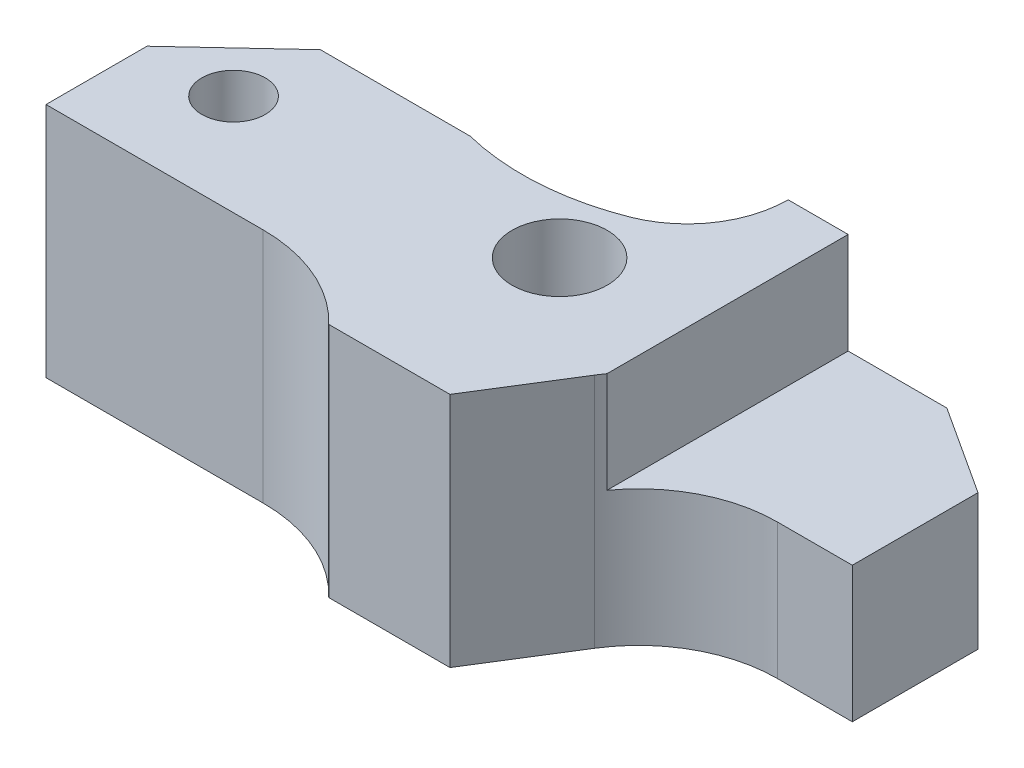
ISO-10303-21;
HEADER;
FILE_DESCRIPTION(('STEP AP214'),'2;1');
FILE_NAME('part.step','',(''),(''),'','','');
FILE_SCHEMA(('AUTOMOTIVE_DESIGN { 1 0 10303 214 1 1 1 1 }'));
ENDSEC;
DATA;
#1=APPLICATION_CONTEXT('core data for automotive mechanical design processes');
#2=APPLICATION_PROTOCOL_DEFINITION('international standard','automotive_design',2000,#1);
#3=PRODUCT_CONTEXT('',#1,'mechanical');
#4=PRODUCT('Part','Part','',(#3));
#5=PRODUCT_RELATED_PRODUCT_CATEGORY('part','',(#4));
#6=PRODUCT_DEFINITION_FORMATION('','',#4);
#7=PRODUCT_DEFINITION_CONTEXT('part definition',#1,'design');
#8=PRODUCT_DEFINITION('design','',#6,#7);
#9=PRODUCT_DEFINITION_SHAPE('','',#8);
#10=(LENGTH_UNIT() NAMED_UNIT(*) SI_UNIT(.MILLI.,.METRE.));
#11=(NAMED_UNIT(*) PLANE_ANGLE_UNIT() SI_UNIT($,.RADIAN.));
#12=(NAMED_UNIT(*) SI_UNIT($,.STERADIAN.) SOLID_ANGLE_UNIT());
#13=UNCERTAINTY_MEASURE_WITH_UNIT(LENGTH_MEASURE(1.E-05),#10,'distance_accuracy_value','');
#14=(GEOMETRIC_REPRESENTATION_CONTEXT(3) GLOBAL_UNCERTAINTY_ASSIGNED_CONTEXT((#13)) GLOBAL_UNIT_ASSIGNED_CONTEXT((#10,
#11,#12)) REPRESENTATION_CONTEXT('',''));
#15=CARTESIAN_POINT('',(0.,0.,0.));
#16=DIRECTION('',(0.,0.,1.));
#17=DIRECTION('',(1.,0.,0.));
#18=AXIS2_PLACEMENT_3D('',#15,#16,#17);
#19=CARTESIAN_POINT('',(0.,82.,-64.));
#20=DIRECTION('',(0.,0.,1.));
#21=DIRECTION('',(1.,0.,0.));
#22=AXIS2_PLACEMENT_3D('',#19,#20,#21);
#23=PLANE('',#22);
#24=DIRECTION('',(1.,0.,0.));
#25=VECTOR('',#24,1.);
#26=CARTESIAN_POINT('',(74.6896475118054,55.,-64.));
#27=LINE('',#26,#25);
#28=CARTESIAN_POINT('',(31.0986925907159,55.,-64.));
#29=VERTEX_POINT('',#28);
#30=CARTESIAN_POINT('',(74.6896475118054,55.,-64.));
#31=VERTEX_POINT('',#30);
#32=EDGE_CURVE('E189',#29,#31,#27,.T.);
#33=ORIENTED_EDGE('',*,*,#32,.F.);
#34=DIRECTION('',(0.,-1.,0.));
#35=VECTOR('',#34,1.);
#36=CARTESIAN_POINT('',(31.0986925907159,82.,-64.));
#37=LINE('',#36,#35);
#38=CARTESIAN_POINT('',(31.0986925907159,82.,-64.));
#39=VERTEX_POINT('',#38);
#40=EDGE_CURVE('E201',#39,#29,#37,.T.);
#41=ORIENTED_EDGE('',*,*,#40,.F.);
#42=DIRECTION('',(-1.,0.,0.));
#43=VECTOR('',#42,1.);
#44=CARTESIAN_POINT('',(0.,82.,-64.));
#45=LINE('',#44,#43);
#46=CARTESIAN_POINT('',(83.,82.,-64.));
#47=VERTEX_POINT('',#46);
#48=EDGE_CURVE('E255',#47,#39,#45,.T.);
#49=ORIENTED_EDGE('',*,*,#48,.F.);
#50=DIRECTION('',(0.,-1.,0.));
#51=VECTOR('',#50,1.);
#52=CARTESIAN_POINT('',(83.,82.,-64.));
#53=LINE('',#52,#51);
#54=CARTESIAN_POINT('',(83.,0.,-64.));
#55=VERTEX_POINT('',#54);
#56=EDGE_CURVE('E54',#47,#55,#53,.T.);
#57=ORIENTED_EDGE('',*,*,#56,.T.);
#58=DIRECTION('',(-1.,0.,0.));
#59=VECTOR('',#58,1.);
#60=CARTESIAN_POINT('',(0.,0.,-64.));
#61=LINE('',#60,#59);
#62=CARTESIAN_POINT('',(31.0986925907159,0.,-64.));
#63=VERTEX_POINT('',#62);
#64=EDGE_CURVE('E288',#55,#63,#61,.T.);
#65=ORIENTED_EDGE('',*,*,#64,.T.);
#66=CARTESIAN_POINT('',(31.0986925907159,15.,-64.));
#67=VERTEX_POINT('',#66);
#68=EDGE_CURVE('E210',#67,#63,#37,.T.);
#69=ORIENTED_EDGE('',*,*,#68,.F.);
#70=DIRECTION('',(1.,0.,0.));
#71=VECTOR('',#70,1.);
#72=CARTESIAN_POINT('',(74.6896475118054,15.,-64.));
#73=LINE('',#72,#71);
#74=CARTESIAN_POINT('',(74.6896475118054,15.,-64.));
#75=VERTEX_POINT('',#74);
#76=EDGE_CURVE('E589',#67,#75,#73,.T.);
#77=ORIENTED_EDGE('',*,*,#76,.T.);
#78=DIRECTION('',(0.,-1.,0.));
#79=VECTOR('',#78,1.);
#80=CARTESIAN_POINT('',(74.6896475118054,55.,-64.));
#81=LINE('',#80,#79);
#82=EDGE_CURVE('E204',#31,#75,#81,.T.);
#83=ORIENTED_EDGE('',*,*,#82,.F.);
#84=EDGE_LOOP('',(#33,#41,#49,#57,#65,#69,#77,#83));
#85=FACE_BOUND('',#84,.T.);
#86=ADVANCED_FACE('F45',(#85),#23,.F.);
#87=CARTESIAN_POINT('',(-17.4573708795469,82.,-18.7207382905222));
#88=DIRECTION('',(-0.681998360062497,0.,-0.731353701619172));
#89=DIRECTION('',(-0.731353701619172,0.,0.681998360062497));
#90=AXIS2_PLACEMENT_3D('',#87,#88,#89);
#91=PLANE('',#90);
#92=ORIENTED_EDGE('',*,*,#40,.T.);
#93=DIRECTION('',(0.731353701619171,0.,-0.681998360062498));
#94=VECTOR('',#93,1.);
#95=CARTESIAN_POINT('',(0.,55.,-35.));
#96=LINE('',#95,#94);
#97=CARTESIAN_POINT('',(0.,55.,-35.));
#98=VERTEX_POINT('',#97);
#99=EDGE_CURVE('E184',#98,#29,#96,.T.);
#100=ORIENTED_EDGE('',*,*,#99,.F.);
#101=DIRECTION('',(0.,-1.,0.));
#102=VECTOR('',#101,1.);
#103=CARTESIAN_POINT('',(0.,82.,-35.));
#104=LINE('',#103,#102);
#105=CARTESIAN_POINT('',(0.,82.,-35.));
#106=VERTEX_POINT('',#105);
#107=EDGE_CURVE('E213',#106,#98,#104,.T.);
#108=ORIENTED_EDGE('',*,*,#107,.F.);
#109=DIRECTION('',(0.731353701619171,0.,-0.681998360062497));
#110=VECTOR('',#109,1.);
#111=CARTESIAN_POINT('',(-17.4573708795469,82.,-18.7207382905222));
#112=LINE('',#111,#110);
#113=EDGE_CURVE('E209',#106,#39,#112,.T.);
#114=ORIENTED_EDGE('',*,*,#113,.T.);
#115=EDGE_LOOP('',(#92,#100,#108,#114));
#116=FACE_BOUND('',#115,.T.);
#117=ADVANCED_FACE('F207',(#116),#91,.T.);
#118=CARTESIAN_POINT('',(0.,82.,0.));
#119=DIRECTION('',(-1.,0.,0.));
#120=DIRECTION('',(0.,0.,1.));
#121=AXIS2_PLACEMENT_3D('',#118,#119,#120);
#122=PLANE('',#121);
#123=ORIENTED_EDGE('',*,*,#107,.T.);
#124=DIRECTION('',(0.,0.,-1.));
#125=VECTOR('',#124,1.);
#126=CARTESIAN_POINT('',(0.,55.,-12.));
#127=LINE('',#126,#125);
#128=CARTESIAN_POINT('',(0.,55.,-12.));
#129=VERTEX_POINT('',#128);
#130=EDGE_CURVE('E192',#129,#98,#127,.T.);
#131=ORIENTED_EDGE('',*,*,#130,.F.);
#132=DIRECTION('',(0.,-1.,0.));
#133=VECTOR('',#132,1.);
#134=CARTESIAN_POINT('',(0.,55.,-12.));
#135=LINE('',#134,#133);
#136=CARTESIAN_POINT('',(0.,15.,-12.));
#137=VERTEX_POINT('',#136);
#138=EDGE_CURVE('E218',#129,#137,#135,.T.);
#139=ORIENTED_EDGE('',*,*,#138,.T.);
#140=DIRECTION('',(0.,0.,-1.));
#141=VECTOR('',#140,1.);
#142=CARTESIAN_POINT('',(0.,15.,-12.));
#143=LINE('',#142,#141);
#144=CARTESIAN_POINT('',(0.,15.,-35.));
#145=VERTEX_POINT('',#144);
#146=EDGE_CURVE('E196',#137,#145,#143,.T.);
#147=ORIENTED_EDGE('',*,*,#146,.T.);
#148=CARTESIAN_POINT('',(0.,0.,-35.));
#149=VERTEX_POINT('',#148);
#150=EDGE_CURVE('E348',#145,#149,#104,.T.);
#151=ORIENTED_EDGE('',*,*,#150,.T.);
#152=DIRECTION('',(0.,0.,-1.));
#153=VECTOR('',#152,1.);
#154=CARTESIAN_POINT('',(0.,0.,0.));
#155=LINE('',#154,#153);
#156=CARTESIAN_POINT('',(0.,0.,0.));
#157=VERTEX_POINT('',#156);
#158=EDGE_CURVE('E294',#157,#149,#155,.T.);
#159=ORIENTED_EDGE('',*,*,#158,.F.);
#160=DIRECTION('',(0.,-1.,0.));
#161=VECTOR('',#160,1.);
#162=CARTESIAN_POINT('',(0.,82.,0.));
#163=LINE('',#162,#161);
#164=CARTESIAN_POINT('',(0.,82.,0.));
#165=VERTEX_POINT('',#164);
#166=EDGE_CURVE('E347',#165,#157,#163,.T.);
#167=ORIENTED_EDGE('',*,*,#166,.F.);
#168=DIRECTION('',(0.,0.,-1.));
#169=VECTOR('',#168,1.);
#170=CARTESIAN_POINT('',(0.,82.,0.));
#171=LINE('',#170,#169);
#172=EDGE_CURVE('E259',#165,#106,#171,.T.);
#173=ORIENTED_EDGE('',*,*,#172,.T.);
#174=EDGE_LOOP('',(#123,#131,#139,#147,#151,#159,#167,#173));
#175=FACE_BOUND('',#174,.T.);
#176=ADVANCED_FACE('F354',(#175),#122,.T.);
#177=CARTESIAN_POINT('',(30.,0.,-35.));
#178=DIRECTION('',(0.,1.,0.));
#179=DIRECTION('',(0.,0.,1.));
#180=AXIS2_PLACEMENT_3D('',#177,#178,#179);
#181=CYLINDRICAL_SURFACE('',#180,11.);
#182=CARTESIAN_POINT('',(30.,82.,-35.));
#183=DIRECTION('',(0.,1.,0.));
#184=DIRECTION('',(0.,0.,1.));
#185=AXIS2_PLACEMENT_3D('',#182,#183,#184);
#186=CIRCLE('',#185,11.);
#187=CARTESIAN_POINT('',(30.,82.,-24.));
#188=VERTEX_POINT('',#187);
#189=EDGE_CURVE('E245',#188,#188,#186,.T.);
#190=ORIENTED_EDGE('',*,*,#189,.T.);
#191=EDGE_LOOP('',(#190));
#192=FACE_BOUND('',#191,.T.);
#193=CARTESIAN_POINT('',(30.,55.,-35.));
#194=DIRECTION('',(0.,-1.,0.));
#195=DIRECTION('',(0.,0.,-1.));
#196=AXIS2_PLACEMENT_3D('',#193,#194,#195);
#197=CIRCLE('',#196,11.);
#198=CARTESIAN_POINT('',(30.,55.,-46.));
#199=VERTEX_POINT('',#198);
#200=EDGE_CURVE('E49',#199,#199,#197,.F.);
#201=ORIENTED_EDGE('',*,*,#200,.F.);
#202=EDGE_LOOP('',(#201));
#203=FACE_BOUND('',#202,.T.);
#204=ADVANCED_FACE('F431',(#192,#203),#181,.F.);
#205=CARTESIAN_POINT('',(103.62630849505,82.,-147.333777641255));
#206=DIRECTION('',(0.,-1.,0.));
#207=DIRECTION('',(0.,0.,-1.));
#208=AXIS2_PLACEMENT_3D('',#205,#206,#207);
#209=CYLINDRICAL_SURFACE('',#208,85.8484892010049);
#210=CARTESIAN_POINT('',(103.62630849505,0.,-147.333777641255));
#211=DIRECTION('',(0.,1.,0.));
#212=DIRECTION('',(0.,0.,1.));
#213=AXIS2_PLACEMENT_3D('',#210,#211,#212);
#214=CIRCLE('',#213,85.8484892010049);
#215=CARTESIAN_POINT('',(134.98919130031,0.,-67.4192440429248));
#216=VERTEX_POINT('',#215);
#217=EDGE_CURVE('E249',#55,#216,#214,.T.);
#218=ORIENTED_EDGE('',*,*,#217,.F.);
#219=ORIENTED_EDGE('',*,*,#56,.F.);
#220=CARTESIAN_POINT('',(103.62630849505,82.,-147.333777641255));
#221=DIRECTION('',(0.,1.,0.));
#222=DIRECTION('',(0.,0.,1.));
#223=AXIS2_PLACEMENT_3D('',#220,#221,#222);
#224=CIRCLE('',#223,85.8484892010049);
#225=CARTESIAN_POINT('',(134.98919130031,82.,-67.4192440429248));
#226=VERTEX_POINT('',#225);
#227=EDGE_CURVE('E252',#47,#226,#224,.T.);
#228=ORIENTED_EDGE('',*,*,#227,.T.);
#229=DIRECTION('',(0.,-1.,0.));
#230=VECTOR('',#229,1.);
#231=CARTESIAN_POINT('',(134.98919130031,82.,-67.4192440429248));
#232=LINE('',#231,#230);
#233=EDGE_CURVE('E285',#226,#216,#232,.T.);
#234=ORIENTED_EDGE('',*,*,#233,.T.);
#235=EDGE_LOOP('',(#218,#219,#228,#234));
#236=FACE_BOUND('',#235,.T.);
#237=ADVANCED_FACE('F47',(#236),#209,.F.);
#238=DIRECTION('',(0.731353701619171,0.,-0.681998360062498));
#239=VECTOR('',#238,1.);
#240=CARTESIAN_POINT('',(0.,15.,-35.));
#241=LINE('',#240,#239);
#242=EDGE_CURVE('E62',#145,#67,#241,.T.);
#243=ORIENTED_EDGE('',*,*,#242,.T.);
#244=ORIENTED_EDGE('',*,*,#68,.T.);
#245=DIRECTION('',(0.731353701619171,0.,-0.681998360062497));
#246=VECTOR('',#245,1.);
#247=CARTESIAN_POINT('',(-17.4573708795469,0.,-18.7207382905222));
#248=LINE('',#247,#246);
#249=EDGE_CURVE('E291',#149,#63,#248,.T.);
#250=ORIENTED_EDGE('',*,*,#249,.F.);
#251=ORIENTED_EDGE('',*,*,#150,.F.);
#252=EDGE_LOOP('',(#243,#244,#250,#251));
#253=FACE_BOUND('',#252,.T.);
#254=ADVANCED_FACE('F414',(#253),#91,.T.);
#255=CARTESIAN_POINT('',(0.,82.,0.));
#256=DIRECTION('',(0.,0.,1.));
#257=DIRECTION('',(1.,0.,0.));
#258=AXIS2_PLACEMENT_3D('',#255,#256,#257);
#259=PLANE('',#258);
#260=DIRECTION('',(-1.,0.,0.));
#261=VECTOR('',#260,1.);
#262=CARTESIAN_POINT('',(0.,0.,0.));
#263=LINE('',#262,#261);
#264=CARTESIAN_POINT('',(75.2382092958579,0.,0.));
#265=VERTEX_POINT('',#264);
#266=EDGE_CURVE('E297',#265,#157,#263,.T.);
#267=ORIENTED_EDGE('',*,*,#266,.F.);
#268=DIRECTION('',(0.,-1.,0.));
#269=VECTOR('',#268,1.);
#270=CARTESIAN_POINT('',(75.2382092958579,82.,0.));
#271=LINE('',#270,#269);
#272=CARTESIAN_POINT('',(75.2382092958579,82.,0.));
#273=VERTEX_POINT('',#272);
#274=EDGE_CURVE('E346',#273,#265,#271,.T.);
#275=ORIENTED_EDGE('',*,*,#274,.F.);
#276=DIRECTION('',(-1.,0.,0.));
#277=VECTOR('',#276,1.);
#278=CARTESIAN_POINT('',(0.,82.,0.));
#279=LINE('',#278,#277);
#280=EDGE_CURVE('E262',#273,#165,#279,.T.);
#281=ORIENTED_EDGE('',*,*,#280,.T.);
#282=ORIENTED_EDGE('',*,*,#166,.T.);
#283=EDGE_LOOP('',(#267,#275,#281,#282));
#284=FACE_BOUND('',#283,.T.);
#285=ADVANCED_FACE('F412',(#284),#259,.T.);
#286=CARTESIAN_POINT('',(75.2382092958579,82.,55.0000000000001));
#287=DIRECTION('',(0.,-1.,0.));
#288=DIRECTION('',(0.,0.,-1.));
#289=AXIS2_PLACEMENT_3D('',#286,#287,#288);
#290=CYLINDRICAL_SURFACE('',#289,55.0000000000001);
#291=CARTESIAN_POINT('',(75.2382092958579,0.,55.0000000000001));
#292=DIRECTION('',(0.,1.,0.));
#293=DIRECTION('',(0.,0.,1.));
#294=AXIS2_PLACEMENT_3D('',#291,#292,#293);
#295=CIRCLE('',#294,55.0000000000001);
#296=CARTESIAN_POINT('',(115.,0.,17.));
#297=VERTEX_POINT('',#296);
#298=EDGE_CURVE('E300',#297,#265,#295,.T.);
#299=ORIENTED_EDGE('',*,*,#298,.F.);
#300=DIRECTION('',(0.,-1.,0.));
#301=VECTOR('',#300,1.);
#302=CARTESIAN_POINT('',(115.,82.,17.));
#303=LINE('',#302,#301);
#304=CARTESIAN_POINT('',(115.,82.,17.));
#305=VERTEX_POINT('',#304);
#306=EDGE_CURVE('E344',#305,#297,#303,.T.);
#307=ORIENTED_EDGE('',*,*,#306,.F.);
#308=CARTESIAN_POINT('',(75.2382092958579,82.,55.0000000000001));
#309=DIRECTION('',(0.,1.,0.));
#310=DIRECTION('',(0.,0.,1.));
#311=AXIS2_PLACEMENT_3D('',#308,#309,#310);
#312=CIRCLE('',#311,55.0000000000001);
#313=EDGE_CURVE('E265',#305,#273,#312,.T.);
#314=ORIENTED_EDGE('',*,*,#313,.T.);
#315=ORIENTED_EDGE('',*,*,#274,.T.);
#316=EDGE_LOOP('',(#299,#307,#314,#315));
#317=FACE_BOUND('',#316,.T.);
#318=ADVANCED_FACE('F411',(#317),#290,.F.);
#319=CARTESIAN_POINT('',(0.,82.,17.));
#320=DIRECTION('',(0.,0.,1.));
#321=DIRECTION('',(1.,0.,0.));
#322=AXIS2_PLACEMENT_3D('',#319,#320,#321);
#323=PLANE('',#322);
#324=DIRECTION('',(-1.,0.,0.));
#325=VECTOR('',#324,1.);
#326=CARTESIAN_POINT('',(0.,0.,17.));
#327=LINE('',#326,#325);
#328=CARTESIAN_POINT('',(157.,0.,17.));
#329=VERTEX_POINT('',#328);
#330=EDGE_CURVE('E303',#329,#297,#327,.T.);
#331=ORIENTED_EDGE('',*,*,#330,.F.);
#332=DIRECTION('',(0.,-1.,0.));
#333=VECTOR('',#332,1.);
#334=CARTESIAN_POINT('',(157.,82.,17.));
#335=LINE('',#334,#333);
#336=CARTESIAN_POINT('',(157.,82.,17.));
#337=VERTEX_POINT('',#336);
#338=EDGE_CURVE('E342',#337,#329,#335,.T.);
#339=ORIENTED_EDGE('',*,*,#338,.F.);
#340=DIRECTION('',(-1.,0.,0.));
#341=VECTOR('',#340,1.);
#342=CARTESIAN_POINT('',(0.,82.,17.));
#343=LINE('',#342,#341);
#344=EDGE_CURVE('E268',#337,#305,#343,.T.);
#345=ORIENTED_EDGE('',*,*,#344,.T.);
#346=ORIENTED_EDGE('',*,*,#306,.T.);
#347=EDGE_LOOP('',(#331,#339,#345,#346));
#348=FACE_BOUND('',#347,.T.);
#349=ADVANCED_FACE('F407',(#348),#323,.T.);
#350=CARTESIAN_POINT('',(120.551884416484,82.,75.3291778867784));
#351=DIRECTION('',(0.84804809615642,0.,0.529919264233214));
#352=DIRECTION('',(0.529919264233214,0.,-0.84804809615642));
#353=AXIS2_PLACEMENT_3D('',#350,#351,#352);
#354=PLANE('',#353);
#355=DIRECTION('',(-0.529919264233214,0.,0.84804809615642));
#356=VECTOR('',#355,1.);
#357=CARTESIAN_POINT('',(120.551884416484,0.,75.3291778867784));
#358=LINE('',#357,#356);
#359=CARTESIAN_POINT('',(176.293691384492,0.,-13.8763605152637));
#360=VERTEX_POINT('',#359);
#361=EDGE_CURVE('E306',#360,#329,#358,.T.);
#362=ORIENTED_EDGE('',*,*,#361,.F.);
#363=DIRECTION('',(0.,-1.,0.));
#364=VECTOR('',#363,1.);
#365=CARTESIAN_POINT('',(176.293691384492,82.,-13.8763605152637));
#366=LINE('',#365,#364);
#367=CARTESIAN_POINT('',(176.293691384492,82.,-13.8763605152637));
#368=VERTEX_POINT('',#367);
#369=EDGE_CURVE('E340',#368,#360,#366,.T.);
#370=ORIENTED_EDGE('',*,*,#369,.F.);
#371=DIRECTION('',(-0.529919264233214,0.,0.84804809615642));
#372=VECTOR('',#371,1.);
#373=CARTESIAN_POINT('',(120.551884416484,82.,75.3291778867784));
#374=LINE('',#373,#372);
#375=EDGE_CURVE('E271',#368,#337,#374,.T.);
#376=ORIENTED_EDGE('',*,*,#375,.T.);
#377=ORIENTED_EDGE('',*,*,#338,.T.);
#378=EDGE_LOOP('',(#362,#370,#376,#377));
#379=FACE_BOUND('',#378,.T.);
#380=ADVANCED_FACE('F403',(#379),#354,.T.);
#381=CARTESIAN_POINT('',(217.,82.,11.5597641679305));
#382=DIRECTION('',(0.,-1.,0.));
#383=DIRECTION('',(0.,0.,-1.));
#384=AXIS2_PLACEMENT_3D('',#381,#382,#383);
#385=CYLINDRICAL_SURFACE('',#384,47.9999999999998);
#386=DIRECTION('',(0.,-1.,0.));
#387=VECTOR('',#386,1.);
#388=CARTESIAN_POINT('',(178.,82.,-16.4223729913355));
#389=LINE('',#388,#387);
#390=CARTESIAN_POINT('',(178.,82.,-16.4223729913355));
#391=VERTEX_POINT('',#390);
#392=CARTESIAN_POINT('',(178.,47.,-16.4223729913355));
#393=VERTEX_POINT('',#392);
#394=EDGE_CURVE('E236',#391,#393,#389,.T.);
#395=ORIENTED_EDGE('',*,*,#394,.F.);
#396=CARTESIAN_POINT('',(217.,82.,11.5597641679305));
#397=DIRECTION('',(0.,1.,0.));
#398=DIRECTION('',(0.,0.,1.));
#399=AXIS2_PLACEMENT_3D('',#396,#397,#398);
#400=CIRCLE('',#399,47.9999999999998);
#401=EDGE_CURVE('E274',#391,#368,#400,.T.);
#402=ORIENTED_EDGE('',*,*,#401,.T.);
#403=ORIENTED_EDGE('',*,*,#369,.T.);
#404=CARTESIAN_POINT('',(217.,0.,11.5597641679305));
#405=DIRECTION('',(0.,1.,0.));
#406=DIRECTION('',(0.,0.,1.));
#407=AXIS2_PLACEMENT_3D('',#404,#405,#406);
#408=CIRCLE('',#407,47.9999999999998);
#409=CARTESIAN_POINT('',(217.,0.,-36.4402358320692));
#410=VERTEX_POINT('',#409);
#411=EDGE_CURVE('E309',#410,#360,#408,.T.);
#412=ORIENTED_EDGE('',*,*,#411,.F.);
#413=DIRECTION('',(0.,-1.,0.));
#414=VECTOR('',#413,1.);
#415=CARTESIAN_POINT('',(217.,82.,-36.4402358320692));
#416=LINE('',#415,#414);
#417=CARTESIAN_POINT('',(217.,47.,-36.4402358320692));
#418=VERTEX_POINT('',#417);
#419=EDGE_CURVE('E338',#418,#410,#416,.T.);
#420=ORIENTED_EDGE('',*,*,#419,.F.);
#421=CARTESIAN_POINT('',(217.,47.,11.5597641679305));
#422=DIRECTION('',(0.,-1.,0.));
#423=DIRECTION('',(0.,0.,-1.));
#424=AXIS2_PLACEMENT_3D('',#421,#422,#423);
#425=CIRCLE('',#424,47.9999999999998);
#426=EDGE_CURVE('E243',#393,#418,#425,.T.);
#427=ORIENTED_EDGE('',*,*,#426,.F.);
#428=EDGE_LOOP('',(#395,#402,#403,#412,#420,#427));
#429=FACE_BOUND('',#428,.T.);
#430=ADVANCED_FACE('F397',(#429),#385,.F.);
#431=CARTESIAN_POINT('',(0.,82.,-36.4402358320692));
#432=DIRECTION('',(0.,0.,1.));
#433=DIRECTION('',(1.,0.,0.));
#434=AXIS2_PLACEMENT_3D('',#431,#432,#433);
#435=PLANE('',#434);
#436=DIRECTION('',(1.,0.,0.));
#437=VECTOR('',#436,1.);
#438=CARTESIAN_POINT('',(0.,47.,-36.4402358320692));
#439=LINE('',#438,#437);
#440=CARTESIAN_POINT('',(243.,47.,-36.4402358320692));
#441=VERTEX_POINT('',#440);
#442=EDGE_CURVE('E241',#418,#441,#439,.T.);
#443=ORIENTED_EDGE('',*,*,#442,.F.);
#444=ORIENTED_EDGE('',*,*,#419,.T.);
#445=DIRECTION('',(-1.,0.,0.));
#446=VECTOR('',#445,1.);
#447=CARTESIAN_POINT('',(0.,0.,-36.4402358320692));
#448=LINE('',#447,#446);
#449=CARTESIAN_POINT('',(243.,0.,-36.4402358320693));
#450=VERTEX_POINT('',#449);
#451=EDGE_CURVE('E312',#450,#410,#448,.T.);
#452=ORIENTED_EDGE('',*,*,#451,.F.);
#453=DIRECTION('',(0.,-1.,0.));
#454=VECTOR('',#453,1.);
#455=CARTESIAN_POINT('',(243.,82.,-36.4402358320693));
#456=LINE('',#455,#454);
#457=EDGE_CURVE('E336',#441,#450,#456,.T.);
#458=ORIENTED_EDGE('',*,*,#457,.F.);
#459=EDGE_LOOP('',(#443,#444,#452,#458));
#460=FACE_BOUND('',#459,.T.);
#461=ADVANCED_FACE('F392',(#460),#435,.T.);
#462=CARTESIAN_POINT('',(243.,82.,0.));
#463=DIRECTION('',(1.,0.,0.));
#464=DIRECTION('',(0.,0.,-1.));
#465=AXIS2_PLACEMENT_3D('',#462,#463,#464);
#466=PLANE('',#465);
#467=DIRECTION('',(0.,0.,-1.));
#468=VECTOR('',#467,1.);
#469=CARTESIAN_POINT('',(243.,47.,17.));
#470=LINE('',#469,#468);
#471=CARTESIAN_POINT('',(243.,47.,-80.));
#472=VERTEX_POINT('',#471);
#473=EDGE_CURVE('E233',#441,#472,#470,.T.);
#474=ORIENTED_EDGE('',*,*,#473,.F.);
#475=ORIENTED_EDGE('',*,*,#457,.T.);
#476=DIRECTION('',(0.,0.,1.));
#477=VECTOR('',#476,1.);
#478=CARTESIAN_POINT('',(243.,0.,0.));
#479=LINE('',#478,#477);
#480=CARTESIAN_POINT('',(243.,0.,-80.));
#481=VERTEX_POINT('',#480);
#482=EDGE_CURVE('E315',#481,#450,#479,.T.);
#483=ORIENTED_EDGE('',*,*,#482,.F.);
#484=DIRECTION('',(0.,-1.,0.));
#485=VECTOR('',#484,1.);
#486=CARTESIAN_POINT('',(243.,82.,-80.));
#487=LINE('',#486,#485);
#488=EDGE_CURVE('E334',#472,#481,#487,.T.);
#489=ORIENTED_EDGE('',*,*,#488,.F.);
#490=EDGE_LOOP('',(#474,#475,#483,#489));
#491=FACE_BOUND('',#490,.T.);
#492=ADVANCED_FACE('F386',(#491),#466,.T.);
#493=CARTESIAN_POINT('',(108.623316171998,82.,-167.265238826608));
#494=DIRECTION('',(0.544639035015038,0.,-0.838670567945417));
#495=DIRECTION('',(-0.838670567945417,0.,-0.544639035015038));
#496=AXIS2_PLACEMENT_3D('',#493,#494,#495);
#497=PLANE('',#496);
#498=DIRECTION('',(-0.838670567945417,0.,-0.544639035015038));
#499=VECTOR('',#498,1.);
#500=CARTESIAN_POINT('',(108.623316171998,47.,-167.265238826608));
#501=LINE('',#500,#499);
#502=CARTESIAN_POINT('',(212.202700723709,47.,-100.));
#503=VERTEX_POINT('',#502);
#504=EDGE_CURVE('E239',#472,#503,#501,.T.);
#505=ORIENTED_EDGE('',*,*,#504,.F.);
#506=ORIENTED_EDGE('',*,*,#488,.T.);
#507=DIRECTION('',(0.838670567945417,0.,0.544639035015038));
#508=VECTOR('',#507,1.);
#509=CARTESIAN_POINT('',(108.623316171998,0.,-167.265238826608));
#510=LINE('',#509,#508);
#511=CARTESIAN_POINT('',(212.202700723709,0.,-100.));
#512=VERTEX_POINT('',#511);
#513=EDGE_CURVE('E318',#512,#481,#510,.T.);
#514=ORIENTED_EDGE('',*,*,#513,.F.);
#515=DIRECTION('',(0.,-1.,0.));
#516=VECTOR('',#515,1.);
#517=CARTESIAN_POINT('',(212.202700723709,82.,-100.));
#518=LINE('',#517,#516);
#519=EDGE_CURVE('E332',#503,#512,#518,.T.);
#520=ORIENTED_EDGE('',*,*,#519,.F.);
#521=EDGE_LOOP('',(#505,#506,#514,#520));
#522=FACE_BOUND('',#521,.T.);
#523=ADVANCED_FACE('F381',(#522),#497,.T.);
#524=CARTESIAN_POINT('',(0.,82.,-100.));
#525=DIRECTION('',(0.,0.,-1.));
#526=DIRECTION('',(-1.,0.,0.));
#527=AXIS2_PLACEMENT_3D('',#524,#525,#526);
#528=PLANE('',#527);
#529=DIRECTION('',(0.,1.,0.));
#530=VECTOR('',#529,1.);
#531=CARTESIAN_POINT('',(178.,82.,-100.));
#532=LINE('',#531,#530);
#533=CARTESIAN_POINT('',(178.,47.,-100.));
#534=VERTEX_POINT('',#533);
#535=CARTESIAN_POINT('',(178.,82.,-100.));
#536=VERTEX_POINT('',#535);
#537=EDGE_CURVE('E69',#534,#536,#532,.T.);
#538=ORIENTED_EDGE('',*,*,#537,.F.);
#539=DIRECTION('',(-1.,0.,0.));
#540=VECTOR('',#539,1.);
#541=CARTESIAN_POINT('',(178.,47.,-100.));
#542=LINE('',#541,#540);
#543=EDGE_CURVE('E230',#503,#534,#542,.T.);
#544=ORIENTED_EDGE('',*,*,#543,.F.);
#545=ORIENTED_EDGE('',*,*,#519,.T.);
#546=DIRECTION('',(1.,0.,0.));
#547=VECTOR('',#546,1.);
#548=CARTESIAN_POINT('',(0.,0.,-100.));
#549=LINE('',#548,#547);
#550=CARTESIAN_POINT('',(157.202700723709,0.,-100.));
#551=VERTEX_POINT('',#550);
#552=EDGE_CURVE('E321',#551,#512,#549,.T.);
#553=ORIENTED_EDGE('',*,*,#552,.F.);
#554=DIRECTION('',(0.,-1.,0.));
#555=VECTOR('',#554,1.);
#556=CARTESIAN_POINT('',(157.202700723709,82.,-100.));
#557=LINE('',#556,#555);
#558=CARTESIAN_POINT('',(157.202700723709,82.,-100.));
#559=VERTEX_POINT('',#558);
#560=EDGE_CURVE('E330',#559,#551,#557,.T.);
#561=ORIENTED_EDGE('',*,*,#560,.F.);
#562=DIRECTION('',(1.,0.,0.));
#563=VECTOR('',#562,1.);
#564=CARTESIAN_POINT('',(0.,82.,-100.));
#565=LINE('',#564,#563);
#566=EDGE_CURVE('E276',#559,#536,#565,.T.);
#567=ORIENTED_EDGE('',*,*,#566,.T.);
#568=EDGE_LOOP('',(#538,#544,#545,#553,#561,#567));
#569=FACE_BOUND('',#568,.T.);
#570=ADVANCED_FACE('F375',(#569),#528,.T.);
#571=CARTESIAN_POINT('',(122.202700723709,82.,-100.));
#572=DIRECTION('',(0.,-1.,0.));
#573=DIRECTION('',(0.,0.,-1.));
#574=AXIS2_PLACEMENT_3D('',#571,#572,#573);
#575=CYLINDRICAL_SURFACE('',#574,35.0000000000001);
#576=CARTESIAN_POINT('',(122.202700723709,0.,-100.));
#577=DIRECTION('',(0.,1.,0.));
#578=DIRECTION('',(0.,0.,1.));
#579=AXIS2_PLACEMENT_3D('',#576,#577,#578);
#580=CIRCLE('',#579,35.0000000000001);
#581=EDGE_CURVE('E324',#216,#551,#580,.T.);
#582=ORIENTED_EDGE('',*,*,#581,.F.);
#583=ORIENTED_EDGE('',*,*,#233,.F.);
#584=CARTESIAN_POINT('',(122.202700723709,82.,-100.));
#585=DIRECTION('',(0.,1.,0.));
#586=DIRECTION('',(0.,0.,1.));
#587=AXIS2_PLACEMENT_3D('',#584,#585,#586);
#588=CIRCLE('',#587,35.0000000000001);
#589=EDGE_CURVE('E279',#226,#559,#588,.T.);
#590=ORIENTED_EDGE('',*,*,#589,.T.);
#591=ORIENTED_EDGE('',*,*,#560,.T.);
#592=EDGE_LOOP('',(#582,#583,#590,#591));
#593=FACE_BOUND('',#592,.T.);
#594=ADVANCED_FACE('F371',(#593),#575,.F.);
#595=CARTESIAN_POINT('',(135.,82.,-43.));
#596=DIRECTION('',(0.,-1.,0.));
#597=DIRECTION('',(0.,0.,-1.));
#598=AXIS2_PLACEMENT_3D('',#595,#596,#597);
#599=CYLINDRICAL_SURFACE('',#598,16.5);
#600=CARTESIAN_POINT('',(135.,82.,-43.));
#601=DIRECTION('',(0.,1.,0.));
#602=DIRECTION('',(0.,0.,1.));
#603=AXIS2_PLACEMENT_3D('',#600,#601,#602);
#604=CIRCLE('',#603,16.5);
#605=CARTESIAN_POINT('',(135.,82.,-26.5));
#606=VERTEX_POINT('',#605);
#607=EDGE_CURVE('E282',#606,#606,#604,.T.);
#608=ORIENTED_EDGE('',*,*,#607,.T.);
#609=EDGE_LOOP('',(#608));
#610=FACE_BOUND('',#609,.T.);
#611=CARTESIAN_POINT('',(135.,0.,-43.));
#612=DIRECTION('',(0.,1.,0.));
#613=DIRECTION('',(0.,0.,1.));
#614=AXIS2_PLACEMENT_3D('',#611,#612,#613);
#615=CIRCLE('',#614,16.5);
#616=CARTESIAN_POINT('',(135.,0.,-26.5));
#617=VERTEX_POINT('',#616);
#618=EDGE_CURVE('E256',#617,#617,#615,.T.);
#619=ORIENTED_EDGE('',*,*,#618,.F.);
#620=EDGE_LOOP('',(#619));
#621=FACE_BOUND('',#620,.T.);
#622=ADVANCED_FACE('F460',(#610,#621),#599,.F.);
#623=CARTESIAN_POINT('',(0.,82.,0.));
#624=DIRECTION('',(0.,1.,0.));
#625=DIRECTION('',(0.,0.,1.));
#626=AXIS2_PLACEMENT_3D('',#623,#624,#625);
#627=PLANE('',#626);
#628=DIRECTION('',(0.,0.,1.));
#629=VECTOR('',#628,1.);
#630=CARTESIAN_POINT('',(178.,82.,0.));
#631=LINE('',#630,#629);
#632=EDGE_CURVE('E11',#536,#391,#631,.T.);
#633=ORIENTED_EDGE('',*,*,#632,.F.);
#634=ORIENTED_EDGE('',*,*,#566,.F.);
#635=ORIENTED_EDGE('',*,*,#589,.F.);
#636=ORIENTED_EDGE('',*,*,#227,.F.);
#637=ORIENTED_EDGE('',*,*,#48,.T.);
#638=ORIENTED_EDGE('',*,*,#113,.F.);
#639=ORIENTED_EDGE('',*,*,#172,.F.);
#640=ORIENTED_EDGE('',*,*,#280,.F.);
#641=ORIENTED_EDGE('',*,*,#313,.F.);
#642=ORIENTED_EDGE('',*,*,#344,.F.);
#643=ORIENTED_EDGE('',*,*,#375,.F.);
#644=ORIENTED_EDGE('',*,*,#401,.F.);
#645=EDGE_LOOP('',(#633,#634,#635,#636,#637,#638,#639,#640,#641,#642,#643,#644));
#646=FACE_BOUND('',#645,.T.);
#647=ORIENTED_EDGE('',*,*,#189,.F.);
#648=EDGE_LOOP('',(#647));
#649=FACE_BOUND('',#648,.T.);
#650=ORIENTED_EDGE('',*,*,#607,.F.);
#651=EDGE_LOOP('',(#650));
#652=FACE_BOUND('',#651,.T.);
#653=ADVANCED_FACE('F357',(#646,#649,#652),#627,.T.);
#654=CARTESIAN_POINT('',(0.,0.,0.));
#655=DIRECTION('',(0.,1.,0.));
#656=DIRECTION('',(0.,0.,1.));
#657=AXIS2_PLACEMENT_3D('',#654,#655,#656);
#658=PLANE('',#657);
#659=CARTESIAN_POINT('',(30.,0.,-35.));
#660=DIRECTION('',(0.,1.,0.));
#661=DIRECTION('',(0.,0.,1.));
#662=AXIS2_PLACEMENT_3D('',#659,#660,#661);
#663=CIRCLE('',#662,11.);
#664=CARTESIAN_POINT('',(30.,0.,-24.));
#665=VERTEX_POINT('',#664);
#666=EDGE_CURVE('E246',#665,#665,#663,.T.);
#667=ORIENTED_EDGE('',*,*,#666,.T.);
#668=EDGE_LOOP('',(#667));
#669=FACE_BOUND('',#668,.T.);
#670=ORIENTED_EDGE('',*,*,#217,.T.);
#671=ORIENTED_EDGE('',*,*,#581,.T.);
#672=ORIENTED_EDGE('',*,*,#552,.T.);
#673=ORIENTED_EDGE('',*,*,#513,.T.);
#674=ORIENTED_EDGE('',*,*,#482,.T.);
#675=ORIENTED_EDGE('',*,*,#451,.T.);
#676=ORIENTED_EDGE('',*,*,#411,.T.);
#677=ORIENTED_EDGE('',*,*,#361,.T.);
#678=ORIENTED_EDGE('',*,*,#330,.T.);
#679=ORIENTED_EDGE('',*,*,#298,.T.);
#680=ORIENTED_EDGE('',*,*,#266,.T.);
#681=ORIENTED_EDGE('',*,*,#158,.T.);
#682=ORIENTED_EDGE('',*,*,#249,.T.);
#683=ORIENTED_EDGE('',*,*,#64,.F.);
#684=EDGE_LOOP('',(#670,#671,#672,#673,#674,#675,#676,#677,#678,#679,#680,#681,#682,#683));
#685=FACE_BOUND('',#684,.T.);
#686=ORIENTED_EDGE('',*,*,#618,.T.);
#687=EDGE_LOOP('',(#686));
#688=FACE_BOUND('',#687,.T.);
#689=ADVANCED_FACE('F367',(#669,#685,#688),#658,.F.);
#690=CARTESIAN_POINT('',(30.,15.,-35.));
#691=DIRECTION('',(0.,-1.,0.));
#692=DIRECTION('',(0.,0.,-1.));
#693=AXIS2_PLACEMENT_3D('',#690,#691,#692);
#694=CIRCLE('',#693,11.);
#695=CARTESIAN_POINT('',(30.,15.,-46.));
#696=VERTEX_POINT('',#695);
#697=EDGE_CURVE('E216',#696,#696,#694,.F.);
#698=ORIENTED_EDGE('',*,*,#697,.T.);
#699=EDGE_LOOP('',(#698));
#700=FACE_BOUND('',#699,.T.);
#701=ORIENTED_EDGE('',*,*,#666,.F.);
#702=EDGE_LOOP('',(#701));
#703=FACE_BOUND('',#702,.T.);
#704=ADVANCED_FACE('F437',(#700,#703),#181,.F.);
#705=CARTESIAN_POINT('',(178.,82.,17.));
#706=DIRECTION('',(-1.,0.,0.));
#707=DIRECTION('',(0.,0.,1.));
#708=AXIS2_PLACEMENT_3D('',#705,#706,#707);
#709=PLANE('',#708);
#710=ORIENTED_EDGE('',*,*,#394,.T.);
#711=DIRECTION('',(0.,0.,-1.));
#712=VECTOR('',#711,1.);
#713=CARTESIAN_POINT('',(178.,47.,17.));
#714=LINE('',#713,#712);
#715=EDGE_CURVE('E234',#393,#534,#714,.T.);
#716=ORIENTED_EDGE('',*,*,#715,.T.);
#717=ORIENTED_EDGE('',*,*,#537,.T.);
#718=ORIENTED_EDGE('',*,*,#632,.T.);
#719=EDGE_LOOP('',(#710,#716,#717,#718));
#720=FACE_BOUND('',#719,.T.);
#721=ADVANCED_FACE('F444',(#720),#709,.F.);
#722=CARTESIAN_POINT('',(178.,47.,17.));
#723=DIRECTION('',(0.,-1.,0.));
#724=DIRECTION('',(0.,0.,-1.));
#725=AXIS2_PLACEMENT_3D('',#722,#723,#724);
#726=PLANE('',#725);
#727=ORIENTED_EDGE('',*,*,#426,.T.);
#728=ORIENTED_EDGE('',*,*,#442,.T.);
#729=ORIENTED_EDGE('',*,*,#473,.T.);
#730=ORIENTED_EDGE('',*,*,#504,.T.);
#731=ORIENTED_EDGE('',*,*,#543,.T.);
#732=ORIENTED_EDGE('',*,*,#715,.F.);
#733=EDGE_LOOP('',(#727,#728,#729,#730,#731,#732));
#734=FACE_BOUND('',#733,.T.);
#735=ADVANCED_FACE('F449',(#734),#726,.F.);
#736=CARTESIAN_POINT('',(15.,55.,-70.0947501931113));
#737=DIRECTION('',(0.,-1.,0.));
#738=DIRECTION('',(0.,0.,-1.));
#739=AXIS2_PLACEMENT_3D('',#736,#737,#738);
#740=PLANE('',#739);
#741=ORIENTED_EDGE('',*,*,#99,.T.);
#742=ORIENTED_EDGE('',*,*,#32,.T.);
#743=CARTESIAN_POINT('',(15.,55.,-70.0947501931113));
#744=DIRECTION('',(0.,-1.,0.));
#745=DIRECTION('',(0.,0.,-1.));
#746=AXIS2_PLACEMENT_3D('',#743,#744,#745);
#747=CIRCLE('',#746,60.);
#748=EDGE_CURVE('E205',#31,#129,#747,.T.);
#749=ORIENTED_EDGE('',*,*,#748,.T.);
#750=ORIENTED_EDGE('',*,*,#130,.T.);
#751=EDGE_LOOP('',(#741,#742,#749,#750));
#752=FACE_BOUND('',#751,.T.);
#753=ORIENTED_EDGE('',*,*,#200,.T.);
#754=EDGE_LOOP('',(#753));
#755=FACE_BOUND('',#754,.T.);
#756=ADVANCED_FACE('F186',(#752,#755),#740,.T.);
#757=CARTESIAN_POINT('',(15.,15.,-70.0947501931113));
#758=DIRECTION('',(0.,-1.,0.));
#759=DIRECTION('',(0.,0.,-1.));
#760=AXIS2_PLACEMENT_3D('',#757,#758,#759);
#761=PLANE('',#760);
#762=ORIENTED_EDGE('',*,*,#242,.F.);
#763=ORIENTED_EDGE('',*,*,#146,.F.);
#764=CARTESIAN_POINT('',(15.,15.,-70.0947501931113));
#765=DIRECTION('',(0.,-1.,0.));
#766=DIRECTION('',(0.,0.,-1.));
#767=AXIS2_PLACEMENT_3D('',#764,#765,#766);
#768=CIRCLE('',#767,60.);
#769=EDGE_CURVE('E588',#75,#137,#768,.T.);
#770=ORIENTED_EDGE('',*,*,#769,.F.);
#771=ORIENTED_EDGE('',*,*,#76,.F.);
#772=EDGE_LOOP('',(#762,#763,#770,#771));
#773=FACE_BOUND('',#772,.T.);
#774=ORIENTED_EDGE('',*,*,#697,.F.);
#775=EDGE_LOOP('',(#774));
#776=FACE_BOUND('',#775,.T.);
#777=ADVANCED_FACE('F554',(#773,#776),#761,.F.);
#778=CARTESIAN_POINT('',(15.,55.,-70.0947501931113));
#779=DIRECTION('',(0.,-1.,0.));
#780=DIRECTION('',(0.,0.,-1.));
#781=AXIS2_PLACEMENT_3D('',#778,#779,#780);
#782=CYLINDRICAL_SURFACE('',#781,60.);
#783=ORIENTED_EDGE('',*,*,#769,.T.);
#784=ORIENTED_EDGE('',*,*,#138,.F.);
#785=ORIENTED_EDGE('',*,*,#748,.F.);
#786=ORIENTED_EDGE('',*,*,#82,.T.);
#787=EDGE_LOOP('',(#783,#784,#785,#786));
#788=FACE_BOUND('',#787,.T.);
#789=ADVANCED_FACE('F569',(#788),#782,.F.);
#790=CLOSED_SHELL('',(#86,#117,#176,#204,#237,#254,#285,#318,#349,#380,#430,#461,#492,#523,#570,
#594,#622,#653,#689,#704,#721,#735,#756,#777,#789));
#791=MANIFOLD_SOLID_BREP('B2',#790);
#792=ADVANCED_BREP_SHAPE_REPRESENTATION('',(#18,#791),#14);
#793=SHAPE_DEFINITION_REPRESENTATION(#9,#792);
ENDSEC;
END-ISO-10303-21;
